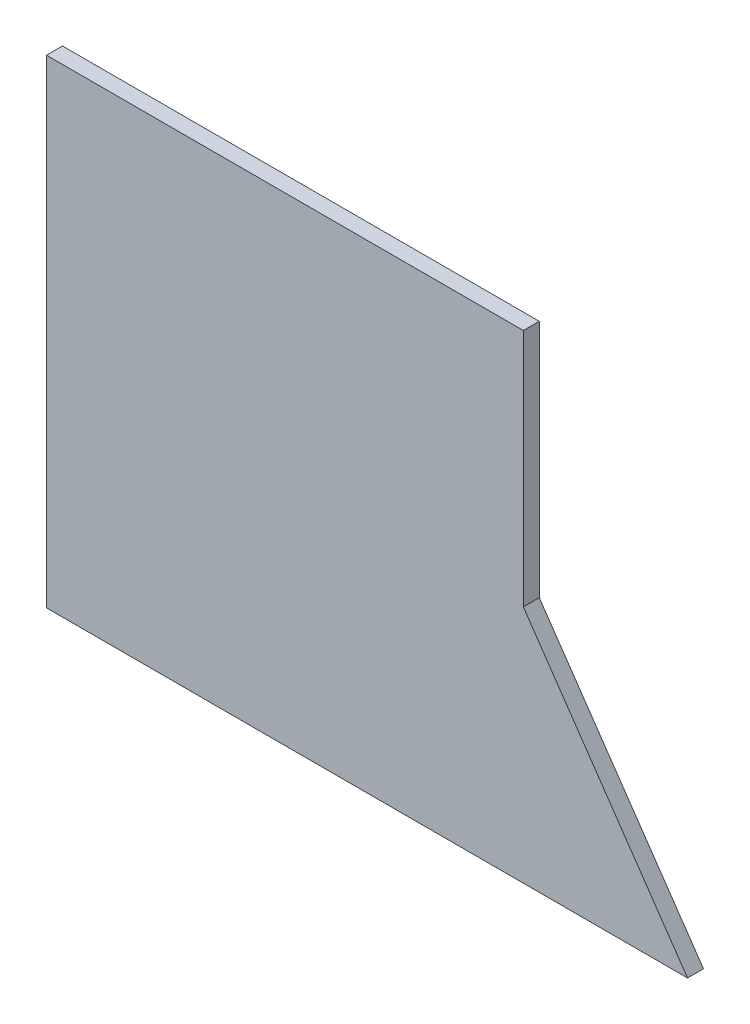
ISO-10303-21;
HEADER;
FILE_DESCRIPTION(('STEP AP214'),'2;1');
FILE_NAME('part.step','',(''),(''),'','','');
FILE_SCHEMA(('AUTOMOTIVE_DESIGN { 1 0 10303 214 1 1 1 1 }'));
ENDSEC;
DATA;
#1=APPLICATION_CONTEXT('core data for automotive mechanical design processes');
#2=APPLICATION_PROTOCOL_DEFINITION('international standard','automotive_design',2000,#1);
#3=PRODUCT_CONTEXT('',#1,'mechanical');
#4=PRODUCT('Part','Part','',(#3));
#5=PRODUCT_RELATED_PRODUCT_CATEGORY('part','',(#4));
#6=PRODUCT_DEFINITION_FORMATION('','',#4);
#7=PRODUCT_DEFINITION_CONTEXT('part definition',#1,'design');
#8=PRODUCT_DEFINITION('design','',#6,#7);
#9=PRODUCT_DEFINITION_SHAPE('','',#8);
#10=(LENGTH_UNIT() NAMED_UNIT(*) SI_UNIT(.MILLI.,.METRE.));
#11=(NAMED_UNIT(*) PLANE_ANGLE_UNIT() SI_UNIT($,.RADIAN.));
#12=(NAMED_UNIT(*) SI_UNIT($,.STERADIAN.) SOLID_ANGLE_UNIT());
#13=UNCERTAINTY_MEASURE_WITH_UNIT(LENGTH_MEASURE(1.E-05),#10,'distance_accuracy_value','');
#14=(GEOMETRIC_REPRESENTATION_CONTEXT(3) GLOBAL_UNCERTAINTY_ASSIGNED_CONTEXT((#13)) GLOBAL_UNIT_ASSIGNED_CONTEXT((#10,
#11,#12)) REPRESENTATION_CONTEXT('',''));
#15=CARTESIAN_POINT('',(0.,0.,0.));
#16=DIRECTION('',(0.,0.,1.));
#17=DIRECTION('',(1.,0.,0.));
#18=AXIS2_PLACEMENT_3D('',#15,#16,#17);
#19=CARTESIAN_POINT('',(-0.3,-0.25,0.01));
#20=DIRECTION('',(1.,0.,0.));
#21=DIRECTION('',(0.,0.,-1.));
#22=AXIS2_PLACEMENT_3D('',#19,#20,#21);
#23=PLANE('',#22);
#24=DIRECTION('',(0.,-1.,0.));
#25=VECTOR('',#24,1.);
#26=CARTESIAN_POINT('',(-0.3,-0.25,-0.01));
#27=LINE('',#26,#25);
#28=CARTESIAN_POINT('',(-0.3,0.35,-0.01));
#29=VERTEX_POINT('',#28);
#30=CARTESIAN_POINT('',(-0.3,-0.25,-0.01));
#31=VERTEX_POINT('',#30);
#32=EDGE_CURVE('E110',#29,#31,#27,.T.);
#33=ORIENTED_EDGE('',*,*,#32,.T.);
#34=DIRECTION('',(0.,0.,-1.));
#35=VECTOR('',#34,1.);
#36=CARTESIAN_POINT('',(-0.3,-0.25,0.01));
#37=LINE('',#36,#35);
#38=CARTESIAN_POINT('',(-0.3,-0.25,0.01));
#39=VERTEX_POINT('',#38);
#40=EDGE_CURVE('E41',#39,#31,#37,.T.);
#41=ORIENTED_EDGE('',*,*,#40,.F.);
#42=DIRECTION('',(0.,-1.,0.));
#43=VECTOR('',#42,1.);
#44=CARTESIAN_POINT('',(-0.3,-0.25,0.01));
#45=LINE('',#44,#43);
#46=CARTESIAN_POINT('',(-0.3,0.35,0.01));
#47=VERTEX_POINT('',#46);
#48=EDGE_CURVE('E84',#47,#39,#45,.T.);
#49=ORIENTED_EDGE('',*,*,#48,.F.);
#50=DIRECTION('',(0.,0.,-1.));
#51=VECTOR('',#50,1.);
#52=CARTESIAN_POINT('',(-0.3,0.35,0.01));
#53=LINE('',#52,#51);
#54=EDGE_CURVE('E11',#47,#29,#53,.T.);
#55=ORIENTED_EDGE('',*,*,#54,.T.);
#56=EDGE_LOOP('',(#33,#41,#49,#55));
#57=FACE_BOUND('',#56,.T.);
#58=ADVANCED_FACE('F33',(#57),#23,.F.);
#59=CARTESIAN_POINT('',(0.503527091985586,-0.25,0.01));
#60=DIRECTION('',(0.,1.,0.));
#61=DIRECTION('',(0.,0.,1.));
#62=AXIS2_PLACEMENT_3D('',#59,#60,#61);
#63=PLANE('',#62);
#64=DIRECTION('',(1.,0.,0.));
#65=VECTOR('',#64,1.);
#66=CARTESIAN_POINT('',(0.503527091985586,-0.25,-0.01));
#67=LINE('',#66,#65);
#68=CARTESIAN_POINT('',(0.503527091985586,-0.25,-0.01));
#69=VERTEX_POINT('',#68);
#70=EDGE_CURVE('E99',#31,#69,#67,.T.);
#71=ORIENTED_EDGE('',*,*,#70,.T.);
#72=DIRECTION('',(0.,0.,-1.));
#73=VECTOR('',#72,1.);
#74=CARTESIAN_POINT('',(0.503527091985586,-0.25,0.01));
#75=LINE('',#74,#73);
#76=CARTESIAN_POINT('',(0.503527091985586,-0.25,0.01));
#77=VERTEX_POINT('',#76);
#78=EDGE_CURVE('E97',#77,#69,#75,.T.);
#79=ORIENTED_EDGE('',*,*,#78,.F.);
#80=DIRECTION('',(1.,0.,0.));
#81=VECTOR('',#80,1.);
#82=CARTESIAN_POINT('',(0.297683813287983,-0.25,0.01));
#83=LINE('',#82,#81);
#84=EDGE_CURVE('E89',#39,#77,#83,.T.);
#85=ORIENTED_EDGE('',*,*,#84,.F.);
#86=ORIENTED_EDGE('',*,*,#40,.T.);
#87=EDGE_LOOP('',(#71,#79,#85,#86));
#88=FACE_BOUND('',#87,.T.);
#89=ADVANCED_FACE('F98',(#88),#63,.F.);
#90=CARTESIAN_POINT('',(0.297683813287983,0.05,0.01));
#91=DIRECTION('',(-0.824563455056813,-0.565769483610393,0.));
#92=DIRECTION('',(0.565769483610393,-0.824563455056813,0.));
#93=AXIS2_PLACEMENT_3D('',#90,#91,#92);
#94=PLANE('',#93);
#95=DIRECTION('',(-0.565769483610393,0.824563455056813,0.));
#96=VECTOR('',#95,1.);
#97=CARTESIAN_POINT('',(0.297683813287983,0.05,-0.01));
#98=LINE('',#97,#96);
#99=CARTESIAN_POINT('',(0.297683813287983,0.05,-0.01));
#100=VERTEX_POINT('',#99);
#101=EDGE_CURVE('E70',#69,#100,#98,.T.);
#102=ORIENTED_EDGE('',*,*,#101,.T.);
#103=DIRECTION('',(0.,0.,-1.));
#104=VECTOR('',#103,1.);
#105=CARTESIAN_POINT('',(0.297683813287983,0.05,0.01));
#106=LINE('',#105,#104);
#107=CARTESIAN_POINT('',(0.297683813287983,0.05,0.01));
#108=VERTEX_POINT('',#107);
#109=EDGE_CURVE('E100',#108,#100,#106,.T.);
#110=ORIENTED_EDGE('',*,*,#109,.F.);
#111=DIRECTION('',(-0.565769483610393,0.824563455056813,0.));
#112=VECTOR('',#111,1.);
#113=CARTESIAN_POINT('',(0.297683813287983,0.05,0.01));
#114=LINE('',#113,#112);
#115=EDGE_CURVE('E93',#77,#108,#114,.T.);
#116=ORIENTED_EDGE('',*,*,#115,.F.);
#117=ORIENTED_EDGE('',*,*,#78,.T.);
#118=EDGE_LOOP('',(#102,#110,#116,#117));
#119=FACE_BOUND('',#118,.T.);
#120=ADVANCED_FACE('F102',(#119),#94,.F.);
#121=CARTESIAN_POINT('',(0.297683813287983,0.35,0.01));
#122=DIRECTION('',(-1.,0.,0.));
#123=DIRECTION('',(0.,0.,1.));
#124=AXIS2_PLACEMENT_3D('',#121,#122,#123);
#125=PLANE('',#124);
#126=DIRECTION('',(0.,1.,0.));
#127=VECTOR('',#126,1.);
#128=CARTESIAN_POINT('',(0.297683813287983,0.35,-0.01));
#129=LINE('',#128,#127);
#130=CARTESIAN_POINT('',(0.297683813287983,0.35,-0.01));
#131=VERTEX_POINT('',#130);
#132=EDGE_CURVE('E77',#100,#131,#129,.T.);
#133=ORIENTED_EDGE('',*,*,#132,.T.);
#134=DIRECTION('',(0.,0.,-1.));
#135=VECTOR('',#134,1.);
#136=CARTESIAN_POINT('',(0.297683813287983,0.35,0.01));
#137=LINE('',#136,#135);
#138=CARTESIAN_POINT('',(0.297683813287983,0.35,0.01));
#139=VERTEX_POINT('',#138);
#140=EDGE_CURVE('E106',#139,#131,#137,.T.);
#141=ORIENTED_EDGE('',*,*,#140,.F.);
#142=DIRECTION('',(0.,1.,0.));
#143=VECTOR('',#142,1.);
#144=CARTESIAN_POINT('',(0.297683813287983,0.35,0.01));
#145=LINE('',#144,#143);
#146=EDGE_CURVE('E104',#108,#139,#145,.T.);
#147=ORIENTED_EDGE('',*,*,#146,.F.);
#148=ORIENTED_EDGE('',*,*,#109,.T.);
#149=EDGE_LOOP('',(#133,#141,#147,#148));
#150=FACE_BOUND('',#149,.T.);
#151=ADVANCED_FACE('F124',(#150),#125,.F.);
#152=CARTESIAN_POINT('',(0.,0.35,0.01));
#153=DIRECTION('',(0.,-1.,0.));
#154=DIRECTION('',(0.,0.,-1.));
#155=AXIS2_PLACEMENT_3D('',#152,#153,#154);
#156=PLANE('',#155);
#157=DIRECTION('',(-1.,0.,0.));
#158=VECTOR('',#157,1.);
#159=CARTESIAN_POINT('',(0.,0.35,-0.01));
#160=LINE('',#159,#158);
#161=EDGE_CURVE('E116',#131,#29,#160,.T.);
#162=ORIENTED_EDGE('',*,*,#161,.T.);
#163=ORIENTED_EDGE('',*,*,#54,.F.);
#164=DIRECTION('',(-1.,0.,0.));
#165=VECTOR('',#164,1.);
#166=CARTESIAN_POINT('',(-0.3,0.35,0.01));
#167=LINE('',#166,#165);
#168=EDGE_CURVE('E49',#139,#47,#167,.T.);
#169=ORIENTED_EDGE('',*,*,#168,.F.);
#170=ORIENTED_EDGE('',*,*,#140,.T.);
#171=EDGE_LOOP('',(#162,#163,#169,#170));
#172=FACE_BOUND('',#171,.T.);
#173=ADVANCED_FACE('F123',(#172),#156,.F.);
#174=CARTESIAN_POINT('',(0.,0.,0.01));
#175=DIRECTION('',(0.,0.,-1.));
#176=DIRECTION('',(-1.,0.,0.));
#177=AXIS2_PLACEMENT_3D('',#174,#175,#176);
#178=PLANE('',#177);
#179=ORIENTED_EDGE('',*,*,#168,.T.);
#180=ORIENTED_EDGE('',*,*,#48,.T.);
#181=ORIENTED_EDGE('',*,*,#84,.T.);
#182=ORIENTED_EDGE('',*,*,#115,.T.);
#183=ORIENTED_EDGE('',*,*,#146,.T.);
#184=EDGE_LOOP('',(#179,#180,#181,#182,#183));
#185=FACE_BOUND('',#184,.T.);
#186=ADVANCED_FACE('F91',(#185),#178,.F.);
#187=CARTESIAN_POINT('',(0.,0.,-0.01));
#188=DIRECTION('',(0.,0.,-1.));
#189=DIRECTION('',(-1.,0.,0.));
#190=AXIS2_PLACEMENT_3D('',#187,#188,#189);
#191=PLANE('',#190);
#192=ORIENTED_EDGE('',*,*,#32,.F.);
#193=ORIENTED_EDGE('',*,*,#161,.F.);
#194=ORIENTED_EDGE('',*,*,#132,.F.);
#195=ORIENTED_EDGE('',*,*,#101,.F.);
#196=ORIENTED_EDGE('',*,*,#70,.F.);
#197=EDGE_LOOP('',(#192,#193,#194,#195,#196));
#198=FACE_BOUND('',#197,.T.);
#199=ADVANCED_FACE('F122',(#198),#191,.T.);
#200=CLOSED_SHELL('',(#58,#89,#120,#151,#173,#186,#199));
#201=MANIFOLD_SOLID_BREP('B2',#200);
#202=ADVANCED_BREP_SHAPE_REPRESENTATION('',(#18,#201),#14);
#203=SHAPE_DEFINITION_REPRESENTATION(#9,#202);
ENDSEC;
END-ISO-10303-21;
